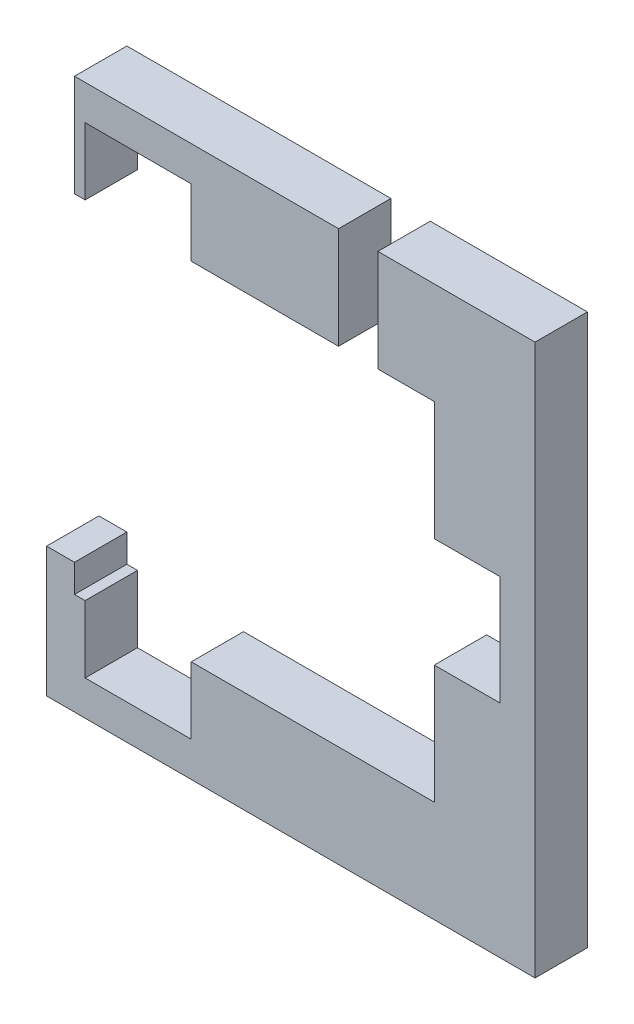
ISO-10303-21;
HEADER;
FILE_DESCRIPTION(('STEP AP214'),'2;1');
FILE_NAME('part.step','',(''),(''),'','','');
FILE_SCHEMA(('AUTOMOTIVE_DESIGN { 1 0 10303 214 1 1 1 1 }'));
ENDSEC;
DATA;
#1=APPLICATION_CONTEXT('core data for automotive mechanical design processes');
#2=APPLICATION_PROTOCOL_DEFINITION('international standard','automotive_design',2000,#1);
#3=PRODUCT_CONTEXT('',#1,'mechanical');
#4=PRODUCT('Part','Part','',(#3));
#5=PRODUCT_RELATED_PRODUCT_CATEGORY('part','',(#4));
#6=PRODUCT_DEFINITION_FORMATION('','',#4);
#7=PRODUCT_DEFINITION_CONTEXT('part definition',#1,'design');
#8=PRODUCT_DEFINITION('design','',#6,#7);
#9=PRODUCT_DEFINITION_SHAPE('','',#8);
#10=(LENGTH_UNIT() NAMED_UNIT(*) SI_UNIT(.MILLI.,.METRE.));
#11=(NAMED_UNIT(*) PLANE_ANGLE_UNIT() SI_UNIT($,.RADIAN.));
#12=(NAMED_UNIT(*) SI_UNIT($,.STERADIAN.) SOLID_ANGLE_UNIT());
#13=UNCERTAINTY_MEASURE_WITH_UNIT(LENGTH_MEASURE(1.E-05),#10,'distance_accuracy_value','');
#14=(GEOMETRIC_REPRESENTATION_CONTEXT(3) GLOBAL_UNCERTAINTY_ASSIGNED_CONTEXT((#13)) GLOBAL_UNIT_ASSIGNED_CONTEXT((#10,
#11,#12)) REPRESENTATION_CONTEXT('',''));
#15=CARTESIAN_POINT('',(0.,0.,0.));
#16=DIRECTION('',(0.,0.,1.));
#17=DIRECTION('',(1.,0.,0.));
#18=AXIS2_PLACEMENT_3D('',#15,#16,#17);
#19=CARTESIAN_POINT('',(7544.80021660651,3379.61343651415,-4.7625));
#20=DIRECTION('',(0.,1.,0.));
#21=DIRECTION('',(0.,0.,-1.));
#22=AXIS2_PLACEMENT_3D('',#19,#20,#21);
#23=PLANE('',#22);
#24=DIRECTION('',(1.,0.,0.));
#25=VECTOR('',#24,1.);
#26=CARTESIAN_POINT('',(7544.80021660651,3379.61343651415,0.));
#27=LINE('',#26,#25);
#28=CARTESIAN_POINT('',(7544.80021660651,3379.61343651415,0.));
#29=VERTEX_POINT('',#28);
#30=CARTESIAN_POINT('',(7589.25021660651,3379.61343651415,0.));
#31=VERTEX_POINT('',#30);
#32=EDGE_CURVE('E200',#29,#31,#27,.T.);
#33=ORIENTED_EDGE('',*,*,#32,.F.);
#34=DIRECTION('',(0.,0.,1.));
#35=VECTOR('',#34,1.);
#36=CARTESIAN_POINT('',(7544.80021660651,3379.61343651415,-4.7625));
#37=LINE('',#36,#35);
#38=CARTESIAN_POINT('',(7544.80021660651,3379.61343651415,-4.7625));
#39=VERTEX_POINT('',#38);
#40=EDGE_CURVE('E199',#39,#29,#37,.T.);
#41=ORIENTED_EDGE('',*,*,#40,.F.);
#42=DIRECTION('',(1.,0.,0.));
#43=VECTOR('',#42,1.);
#44=CARTESIAN_POINT('',(7544.80021660651,3379.61343651415,-4.7625));
#45=LINE('',#44,#43);
#46=CARTESIAN_POINT('',(7589.25021660651,3379.61343651415,-4.7625));
#47=VERTEX_POINT('',#46);
#48=EDGE_CURVE('E248',#39,#47,#45,.T.);
#49=ORIENTED_EDGE('',*,*,#48,.T.);
#50=DIRECTION('',(0.,0.,1.));
#51=VECTOR('',#50,1.);
#52=CARTESIAN_POINT('',(7589.25021660651,3379.61343651415,-4.7625));
#53=LINE('',#52,#51);
#54=EDGE_CURVE('E12',#47,#31,#53,.T.);
#55=ORIENTED_EDGE('',*,*,#54,.T.);
#56=EDGE_LOOP('',(#33,#41,#49,#55));
#57=FACE_BOUND('',#56,.T.);
#58=ADVANCED_FACE('F44',(#57),#23,.F.);
#59=CARTESIAN_POINT('',(7589.25021660651,3429.72763651415,-4.7625));
#60=DIRECTION('',(-1.,0.,0.));
#61=DIRECTION('',(0.,0.,-1.));
#62=AXIS2_PLACEMENT_3D('',#59,#60,#61);
#63=PLANE('',#62);
#64=DIRECTION('',(0.,1.,0.));
#65=VECTOR('',#64,1.);
#66=CARTESIAN_POINT('',(7589.25021660651,3429.72763651415,0.));
#67=LINE('',#66,#65);
#68=CARTESIAN_POINT('',(7589.25021660651,3429.72763651415,0.));
#69=VERTEX_POINT('',#68);
#70=EDGE_CURVE('E202',#31,#69,#67,.T.);
#71=ORIENTED_EDGE('',*,*,#70,.F.);
#72=ORIENTED_EDGE('',*,*,#54,.F.);
#73=DIRECTION('',(0.,1.,0.));
#74=VECTOR('',#73,1.);
#75=CARTESIAN_POINT('',(7589.25021660651,3429.72763651415,-4.7625));
#76=LINE('',#75,#74);
#77=CARTESIAN_POINT('',(7589.25021660651,3429.72763651415,-4.7625));
#78=VERTEX_POINT('',#77);
#79=EDGE_CURVE('E128',#47,#78,#76,.T.);
#80=ORIENTED_EDGE('',*,*,#79,.T.);
#81=DIRECTION('',(0.,0.,1.));
#82=VECTOR('',#81,1.);
#83=CARTESIAN_POINT('',(7589.25021660651,3429.72763651415,-4.7625));
#84=LINE('',#83,#82);
#85=EDGE_CURVE('E52',#78,#69,#84,.T.);
#86=ORIENTED_EDGE('',*,*,#85,.T.);
#87=EDGE_LOOP('',(#71,#72,#80,#86));
#88=FACE_BOUND('',#87,.T.);
#89=ADVANCED_FACE('F290',(#88),#63,.F.);
#90=CARTESIAN_POINT('',(7574.95001660651,3429.72763651415,-4.7625));
#91=DIRECTION('',(0.,-1.,0.));
#92=DIRECTION('',(1.,0.,0.));
#93=AXIS2_PLACEMENT_3D('',#90,#91,#92);
#94=PLANE('',#93);
#95=DIRECTION('',(-1.,0.,0.));
#96=VECTOR('',#95,1.);
#97=CARTESIAN_POINT('',(7574.95001660651,3429.72763651415,0.));
#98=LINE('',#97,#96);
#99=CARTESIAN_POINT('',(7574.95001660651,3429.72763651415,0.));
#100=VERTEX_POINT('',#99);
#101=EDGE_CURVE('E205',#69,#100,#98,.T.);
#102=ORIENTED_EDGE('',*,*,#101,.F.);
#103=ORIENTED_EDGE('',*,*,#85,.F.);
#104=DIRECTION('',(-1.,0.,0.));
#105=VECTOR('',#104,1.);
#106=CARTESIAN_POINT('',(7574.95001660651,3429.72763651415,-4.7625));
#107=LINE('',#106,#105);
#108=CARTESIAN_POINT('',(7574.95001660651,3429.72763651415,-4.7625));
#109=VERTEX_POINT('',#108);
#110=EDGE_CURVE('E299',#78,#109,#107,.T.);
#111=ORIENTED_EDGE('',*,*,#110,.T.);
#112=DIRECTION('',(0.,0.,1.));
#113=VECTOR('',#112,1.);
#114=CARTESIAN_POINT('',(7574.95001660651,3429.72763651415,-4.7625));
#115=LINE('',#114,#113);
#116=EDGE_CURVE('E285',#109,#100,#115,.T.);
#117=ORIENTED_EDGE('',*,*,#116,.T.);
#118=EDGE_LOOP('',(#102,#103,#111,#117));
#119=FACE_BOUND('',#118,.T.);
#120=ADVANCED_FACE('F369',(#119),#94,.F.);
#121=CARTESIAN_POINT('',(7574.95001660651,3429.72763651415,-4.7625));
#122=DIRECTION('',(1.,-1.91603585309036E-13,0.));
#123=DIRECTION('',(1.91603585309036E-13,1.,0.));
#124=AXIS2_PLACEMENT_3D('',#121,#122,#123);
#125=PLANE('',#124);
#126=DIRECTION('',(-1.91603585309036E-13,-1.,0.));
#127=VECTOR('',#126,1.);
#128=CARTESIAN_POINT('',(7574.95001660651,3429.72763651415,0.));
#129=LINE('',#128,#127);
#130=CARTESIAN_POINT('',(7574.95001660651,3420.45663651415,0.));
#131=VERTEX_POINT('',#130);
#132=EDGE_CURVE('E208',#100,#131,#129,.T.);
#133=ORIENTED_EDGE('',*,*,#132,.F.);
#134=ORIENTED_EDGE('',*,*,#116,.F.);
#135=DIRECTION('',(-1.91603585309036E-13,-1.,0.));
#136=VECTOR('',#135,1.);
#137=CARTESIAN_POINT('',(7574.95001660651,3429.72763651415,-4.7625));
#138=LINE('',#137,#136);
#139=CARTESIAN_POINT('',(7574.95001660651,3420.45663651415,-4.7625));
#140=VERTEX_POINT('',#139);
#141=EDGE_CURVE('E303',#109,#140,#138,.T.);
#142=ORIENTED_EDGE('',*,*,#141,.T.);
#143=DIRECTION('',(0.,0.,1.));
#144=VECTOR('',#143,1.);
#145=CARTESIAN_POINT('',(7574.95001660651,3420.45663651415,-4.7625));
#146=LINE('',#145,#144);
#147=EDGE_CURVE('E282',#140,#131,#146,.T.);
#148=ORIENTED_EDGE('',*,*,#147,.T.);
#149=EDGE_LOOP('',(#133,#134,#142,#148));
#150=FACE_BOUND('',#149,.T.);
#151=ADVANCED_FACE('F368',(#150),#125,.F.);
#152=CARTESIAN_POINT('',(7574.95001660651,3420.45663651415,-4.7625));
#153=DIRECTION('',(0.,1.,0.));
#154=DIRECTION('',(0.,0.,-1.));
#155=AXIS2_PLACEMENT_3D('',#152,#153,#154);
#156=PLANE('',#155);
#157=DIRECTION('',(1.,0.,0.));
#158=VECTOR('',#157,1.);
#159=CARTESIAN_POINT('',(7574.95001660651,3420.45663651415,0.));
#160=LINE('',#159,#158);
#161=CARTESIAN_POINT('',(7580.08081660651,3420.45663651415,0.));
#162=VERTEX_POINT('',#161);
#163=EDGE_CURVE('E211',#131,#162,#160,.T.);
#164=ORIENTED_EDGE('',*,*,#163,.F.);
#165=ORIENTED_EDGE('',*,*,#147,.F.);
#166=DIRECTION('',(1.,0.,0.));
#167=VECTOR('',#166,1.);
#168=CARTESIAN_POINT('',(7574.95001660651,3420.45663651415,-4.7625));
#169=LINE('',#168,#167);
#170=CARTESIAN_POINT('',(7580.08081660651,3420.45663651415,-4.7625));
#171=VERTEX_POINT('',#170);
#172=EDGE_CURVE('E306',#140,#171,#169,.T.);
#173=ORIENTED_EDGE('',*,*,#172,.T.);
#174=DIRECTION('',(0.,0.,1.));
#175=VECTOR('',#174,1.);
#176=CARTESIAN_POINT('',(7580.08081660651,3420.45663651415,-4.7625));
#177=LINE('',#176,#175);
#178=EDGE_CURVE('E279',#171,#162,#177,.T.);
#179=ORIENTED_EDGE('',*,*,#178,.T.);
#180=EDGE_LOOP('',(#164,#165,#173,#179));
#181=FACE_BOUND('',#180,.T.);
#182=ADVANCED_FACE('F366',(#181),#156,.F.);
#183=CARTESIAN_POINT('',(7580.08081660651,3420.45663651415,-4.7625));
#184=DIRECTION('',(1.,0.,0.));
#185=DIRECTION('',(0.,0.,1.));
#186=AXIS2_PLACEMENT_3D('',#183,#184,#185);
#187=PLANE('',#186);
#188=DIRECTION('',(0.,-1.,0.));
#189=VECTOR('',#188,1.);
#190=CARTESIAN_POINT('',(7580.08081660651,3420.45663651415,0.));
#191=LINE('',#190,#189);
#192=CARTESIAN_POINT('',(7580.08081660651,3409.64893651415,0.));
#193=VERTEX_POINT('',#192);
#194=EDGE_CURVE('E214',#162,#193,#191,.T.);
#195=ORIENTED_EDGE('',*,*,#194,.F.);
#196=ORIENTED_EDGE('',*,*,#178,.F.);
#197=DIRECTION('',(0.,-1.,0.));
#198=VECTOR('',#197,1.);
#199=CARTESIAN_POINT('',(7580.08081660651,3420.45663651415,-4.7625));
#200=LINE('',#199,#198);
#201=CARTESIAN_POINT('',(7580.08081660651,3409.64893651415,-4.7625));
#202=VERTEX_POINT('',#201);
#203=EDGE_CURVE('E309',#171,#202,#200,.T.);
#204=ORIENTED_EDGE('',*,*,#203,.T.);
#205=DIRECTION('',(0.,0.,1.));
#206=VECTOR('',#205,1.);
#207=CARTESIAN_POINT('',(7580.08081660651,3409.64893651415,-4.7625));
#208=LINE('',#207,#206);
#209=EDGE_CURVE('E276',#202,#193,#208,.T.);
#210=ORIENTED_EDGE('',*,*,#209,.T.);
#211=EDGE_LOOP('',(#195,#196,#204,#210));
#212=FACE_BOUND('',#211,.T.);
#213=ADVANCED_FACE('F362',(#212),#187,.F.);
#214=CARTESIAN_POINT('',(7580.08081660651,3409.64893651415,-4.7625));
#215=DIRECTION('',(0.,1.,0.));
#216=DIRECTION('',(0.,0.,-1.));
#217=AXIS2_PLACEMENT_3D('',#214,#215,#216);
#218=PLANE('',#217);
#219=DIRECTION('',(1.,0.,0.));
#220=VECTOR('',#219,1.);
#221=CARTESIAN_POINT('',(7580.08081660651,3409.64893651415,0.));
#222=LINE('',#221,#220);
#223=CARTESIAN_POINT('',(7586.07521660651,3409.64893651415,0.));
#224=VERTEX_POINT('',#223);
#225=EDGE_CURVE('E217',#193,#224,#222,.T.);
#226=ORIENTED_EDGE('',*,*,#225,.F.);
#227=ORIENTED_EDGE('',*,*,#209,.F.);
#228=DIRECTION('',(1.,0.,0.));
#229=VECTOR('',#228,1.);
#230=CARTESIAN_POINT('',(7580.08081660651,3409.64893651415,-4.7625));
#231=LINE('',#230,#229);
#232=CARTESIAN_POINT('',(7586.07521660651,3409.64893651415,-4.7625));
#233=VERTEX_POINT('',#232);
#234=EDGE_CURVE('E312',#202,#233,#231,.T.);
#235=ORIENTED_EDGE('',*,*,#234,.T.);
#236=DIRECTION('',(0.,0.,1.));
#237=VECTOR('',#236,1.);
#238=CARTESIAN_POINT('',(7586.07521660651,3409.64893651415,-4.7625));
#239=LINE('',#238,#237);
#240=EDGE_CURVE('E273',#233,#224,#239,.T.);
#241=ORIENTED_EDGE('',*,*,#240,.T.);
#242=EDGE_LOOP('',(#226,#227,#235,#241));
#243=FACE_BOUND('',#242,.T.);
#244=ADVANCED_FACE('F359',(#243),#218,.F.);
#245=CARTESIAN_POINT('',(7586.07521660651,3409.64893651415,-4.7625));
#246=DIRECTION('',(1.,0.,0.));
#247=DIRECTION('',(0.,0.,1.));
#248=AXIS2_PLACEMENT_3D('',#245,#246,#247);
#249=PLANE('',#248);
#250=DIRECTION('',(0.,-1.,0.));
#251=VECTOR('',#250,1.);
#252=CARTESIAN_POINT('',(7586.07521660651,3409.64893651415,0.));
#253=LINE('',#252,#251);
#254=CARTESIAN_POINT('',(7586.07521660651,3399.69213651415,0.));
#255=VERTEX_POINT('',#254);
#256=EDGE_CURVE('E220',#224,#255,#253,.T.);
#257=ORIENTED_EDGE('',*,*,#256,.F.);
#258=ORIENTED_EDGE('',*,*,#240,.F.);
#259=DIRECTION('',(0.,-1.,0.));
#260=VECTOR('',#259,1.);
#261=CARTESIAN_POINT('',(7586.07521660651,3409.64893651415,-4.7625));
#262=LINE('',#261,#260);
#263=CARTESIAN_POINT('',(7586.07521660651,3399.69213651415,-4.7625));
#264=VERTEX_POINT('',#263);
#265=EDGE_CURVE('E315',#233,#264,#262,.T.);
#266=ORIENTED_EDGE('',*,*,#265,.T.);
#267=DIRECTION('',(0.,0.,1.));
#268=VECTOR('',#267,1.);
#269=CARTESIAN_POINT('',(7586.07521660651,3399.69213651415,-4.7625));
#270=LINE('',#269,#268);
#271=EDGE_CURVE('E270',#264,#255,#270,.T.);
#272=ORIENTED_EDGE('',*,*,#271,.T.);
#273=EDGE_LOOP('',(#257,#258,#266,#272));
#274=FACE_BOUND('',#273,.T.);
#275=ADVANCED_FACE('F357',(#274),#249,.F.);
#276=CARTESIAN_POINT('',(7580.08081660651,3399.69213651415,-4.7625));
#277=DIRECTION('',(0.,-1.,0.));
#278=DIRECTION('',(0.,0.,1.));
#279=AXIS2_PLACEMENT_3D('',#276,#277,#278);
#280=PLANE('',#279);
#281=DIRECTION('',(-1.,0.,0.));
#282=VECTOR('',#281,1.);
#283=CARTESIAN_POINT('',(7580.08081660651,3399.69213651415,0.));
#284=LINE('',#283,#282);
#285=CARTESIAN_POINT('',(7580.08081660651,3399.69213651415,0.));
#286=VERTEX_POINT('',#285);
#287=EDGE_CURVE('E223',#255,#286,#284,.T.);
#288=ORIENTED_EDGE('',*,*,#287,.F.);
#289=ORIENTED_EDGE('',*,*,#271,.F.);
#290=DIRECTION('',(-1.,0.,0.));
#291=VECTOR('',#290,1.);
#292=CARTESIAN_POINT('',(7580.08081660651,3399.69213651415,-4.7625));
#293=LINE('',#292,#291);
#294=CARTESIAN_POINT('',(7580.08081660651,3399.69213651415,-4.7625));
#295=VERTEX_POINT('',#294);
#296=EDGE_CURVE('E318',#264,#295,#293,.T.);
#297=ORIENTED_EDGE('',*,*,#296,.T.);
#298=DIRECTION('',(0.,0.,1.));
#299=VECTOR('',#298,1.);
#300=CARTESIAN_POINT('',(7580.08081660651,3399.69213651415,-4.7625));
#301=LINE('',#300,#299);
#302=EDGE_CURVE('E267',#295,#286,#301,.T.);
#303=ORIENTED_EDGE('',*,*,#302,.T.);
#304=EDGE_LOOP('',(#288,#289,#297,#303));
#305=FACE_BOUND('',#304,.T.);
#306=ADVANCED_FACE('F353',(#305),#280,.F.);
#307=CARTESIAN_POINT('',(7580.08081660651,3399.69213651415,-4.7625));
#308=DIRECTION('',(1.,0.,0.));
#309=DIRECTION('',(0.,0.,1.));
#310=AXIS2_PLACEMENT_3D('',#307,#308,#309);
#311=PLANE('',#310);
#312=DIRECTION('',(0.,-1.,0.));
#313=VECTOR('',#312,1.);
#314=CARTESIAN_POINT('',(7580.08081660651,3399.69213651415,0.));
#315=LINE('',#314,#313);
#316=CARTESIAN_POINT('',(7580.08081660651,3388.88443651415,0.));
#317=VERTEX_POINT('',#316);
#318=EDGE_CURVE('E226',#286,#317,#315,.T.);
#319=ORIENTED_EDGE('',*,*,#318,.F.);
#320=ORIENTED_EDGE('',*,*,#302,.F.);
#321=DIRECTION('',(0.,-1.,0.));
#322=VECTOR('',#321,1.);
#323=CARTESIAN_POINT('',(7580.08081660651,3399.69213651415,-4.7625));
#324=LINE('',#323,#322);
#325=CARTESIAN_POINT('',(7580.08081660651,3388.88443651415,-4.7625));
#326=VERTEX_POINT('',#325);
#327=EDGE_CURVE('E321',#295,#326,#324,.T.);
#328=ORIENTED_EDGE('',*,*,#327,.T.);
#329=DIRECTION('',(0.,0.,1.));
#330=VECTOR('',#329,1.);
#331=CARTESIAN_POINT('',(7580.08081660651,3388.88443651415,-4.7625));
#332=LINE('',#331,#330);
#333=EDGE_CURVE('E264',#326,#317,#332,.T.);
#334=ORIENTED_EDGE('',*,*,#333,.T.);
#335=EDGE_LOOP('',(#319,#320,#328,#334));
#336=FACE_BOUND('',#335,.T.);
#337=ADVANCED_FACE('F350',(#336),#311,.F.);
#338=CARTESIAN_POINT('',(7580.08081660651,3388.88443651415,-4.7625));
#339=DIRECTION('',(0.,-1.,0.));
#340=DIRECTION('',(0.,0.,1.));
#341=AXIS2_PLACEMENT_3D('',#338,#339,#340);
#342=PLANE('',#341);
#343=DIRECTION('',(-1.,0.,0.));
#344=VECTOR('',#343,1.);
#345=CARTESIAN_POINT('',(7580.08081660651,3388.88443651415,0.));
#346=LINE('',#345,#344);
#347=CARTESIAN_POINT('',(7557.95741660651,3388.88443651415,0.));
#348=VERTEX_POINT('',#347);
#349=EDGE_CURVE('E229',#317,#348,#346,.T.);
#350=ORIENTED_EDGE('',*,*,#349,.F.);
#351=ORIENTED_EDGE('',*,*,#333,.F.);
#352=DIRECTION('',(-1.,0.,0.));
#353=VECTOR('',#352,1.);
#354=CARTESIAN_POINT('',(7580.08081660651,3388.88443651415,-4.7625));
#355=LINE('',#354,#353);
#356=CARTESIAN_POINT('',(7557.95741660651,3388.88443651415,-4.7625));
#357=VERTEX_POINT('',#356);
#358=EDGE_CURVE('E324',#326,#357,#355,.T.);
#359=ORIENTED_EDGE('',*,*,#358,.T.);
#360=DIRECTION('',(0.,0.,1.));
#361=VECTOR('',#360,1.);
#362=CARTESIAN_POINT('',(7557.95741660651,3388.88443651415,-4.7625));
#363=LINE('',#362,#361);
#364=EDGE_CURVE('E261',#357,#348,#363,.T.);
#365=ORIENTED_EDGE('',*,*,#364,.T.);
#366=EDGE_LOOP('',(#350,#351,#359,#365));
#367=FACE_BOUND('',#366,.T.);
#368=ADVANCED_FACE('F348',(#367),#342,.F.);
#369=CARTESIAN_POINT('',(7557.95741660651,3388.88443651415,-4.7625));
#370=DIRECTION('',(1.,2.91397119324194E-13,0.));
#371=DIRECTION('',(-2.91397119324194E-13,1.,0.));
#372=AXIS2_PLACEMENT_3D('',#369,#370,#371);
#373=PLANE('',#372);
#374=DIRECTION('',(2.91397119324194E-13,-1.,0.));
#375=VECTOR('',#374,1.);
#376=CARTESIAN_POINT('',(7557.95741660651,3388.88443651415,0.));
#377=LINE('',#376,#375);
#378=CARTESIAN_POINT('',(7557.95741660651,3382.78843651415,0.));
#379=VERTEX_POINT('',#378);
#380=EDGE_CURVE('E232',#348,#379,#377,.T.);
#381=ORIENTED_EDGE('',*,*,#380,.F.);
#382=ORIENTED_EDGE('',*,*,#364,.F.);
#383=DIRECTION('',(2.91397119324194E-13,-1.,0.));
#384=VECTOR('',#383,1.);
#385=CARTESIAN_POINT('',(7557.95741660651,3388.88443651415,-4.7625));
#386=LINE('',#385,#384);
#387=CARTESIAN_POINT('',(7557.95741660651,3382.78843651415,-4.7625));
#388=VERTEX_POINT('',#387);
#389=EDGE_CURVE('E327',#357,#388,#386,.T.);
#390=ORIENTED_EDGE('',*,*,#389,.T.);
#391=DIRECTION('',(0.,0.,1.));
#392=VECTOR('',#391,1.);
#393=CARTESIAN_POINT('',(7557.95741660651,3382.78843651415,-4.7625));
#394=LINE('',#393,#392);
#395=EDGE_CURVE('E258',#388,#379,#394,.T.);
#396=ORIENTED_EDGE('',*,*,#395,.T.);
#397=EDGE_LOOP('',(#381,#382,#390,#396));
#398=FACE_BOUND('',#397,.T.);
#399=ADVANCED_FACE('F344',(#398),#373,.F.);
#400=CARTESIAN_POINT('',(7548.30541660651,3382.78843651415,-4.7625));
#401=DIRECTION('',(0.,-1.,0.));
#402=DIRECTION('',(0.,0.,1.));
#403=AXIS2_PLACEMENT_3D('',#400,#401,#402);
#404=PLANE('',#403);
#405=DIRECTION('',(-1.,0.,0.));
#406=VECTOR('',#405,1.);
#407=CARTESIAN_POINT('',(7548.30541660651,3382.78843651415,0.));
#408=LINE('',#407,#406);
#409=CARTESIAN_POINT('',(7548.30541660651,3382.78843651415,0.));
#410=VERTEX_POINT('',#409);
#411=EDGE_CURVE('E235',#379,#410,#408,.T.);
#412=ORIENTED_EDGE('',*,*,#411,.F.);
#413=ORIENTED_EDGE('',*,*,#395,.F.);
#414=DIRECTION('',(-1.,0.,0.));
#415=VECTOR('',#414,1.);
#416=CARTESIAN_POINT('',(7548.30541660651,3382.78843651415,-4.7625));
#417=LINE('',#416,#415);
#418=CARTESIAN_POINT('',(7548.30541660651,3382.78843651415,-4.7625));
#419=VERTEX_POINT('',#418);
#420=EDGE_CURVE('E330',#388,#419,#417,.T.);
#421=ORIENTED_EDGE('',*,*,#420,.T.);
#422=DIRECTION('',(0.,0.,1.));
#423=VECTOR('',#422,1.);
#424=CARTESIAN_POINT('',(7548.30541660651,3382.78843651415,-4.7625));
#425=LINE('',#424,#423);
#426=EDGE_CURVE('E255',#419,#410,#425,.T.);
#427=ORIENTED_EDGE('',*,*,#426,.T.);
#428=EDGE_LOOP('',(#412,#413,#421,#427));
#429=FACE_BOUND('',#428,.T.);
#430=ADVANCED_FACE('F341',(#429),#404,.F.);
#431=CARTESIAN_POINT('',(7548.30541660651,3388.88443651415,-4.7625));
#432=DIRECTION('',(-1.,0.,0.));
#433=DIRECTION('',(0.,0.,-1.));
#434=AXIS2_PLACEMENT_3D('',#431,#432,#433);
#435=PLANE('',#434);
#436=DIRECTION('',(0.,1.,0.));
#437=VECTOR('',#436,1.);
#438=CARTESIAN_POINT('',(7548.30541660651,3388.88443651415,0.));
#439=LINE('',#438,#437);
#440=CARTESIAN_POINT('',(7548.30541660651,3388.88443651415,0.));
#441=VERTEX_POINT('',#440);
#442=EDGE_CURVE('E238',#410,#441,#439,.T.);
#443=ORIENTED_EDGE('',*,*,#442,.F.);
#444=ORIENTED_EDGE('',*,*,#426,.F.);
#445=DIRECTION('',(0.,1.,0.));
#446=VECTOR('',#445,1.);
#447=CARTESIAN_POINT('',(7548.30541660651,3388.88443651415,-4.7625));
#448=LINE('',#447,#446);
#449=CARTESIAN_POINT('',(7548.30541660651,3388.88443651415,-4.7625));
#450=VERTEX_POINT('',#449);
#451=EDGE_CURVE('E194',#419,#450,#448,.T.);
#452=ORIENTED_EDGE('',*,*,#451,.T.);
#453=DIRECTION('',(0.,0.,1.));
#454=VECTOR('',#453,1.);
#455=CARTESIAN_POINT('',(7548.30541660651,3388.88443651415,-4.7625));
#456=LINE('',#455,#454);
#457=EDGE_CURVE('E252',#450,#441,#456,.T.);
#458=ORIENTED_EDGE('',*,*,#457,.T.);
#459=EDGE_LOOP('',(#443,#444,#452,#458));
#460=FACE_BOUND('',#459,.T.);
#461=ADVANCED_FACE('F335',(#460),#435,.F.);
#462=CARTESIAN_POINT('',(7548.30541660651,3388.88443651415,-4.7625));
#463=DIRECTION('',(0.,-1.,0.));
#464=DIRECTION('',(0.,0.,1.));
#465=AXIS2_PLACEMENT_3D('',#462,#463,#464);
#466=PLANE('',#465);
#467=DIRECTION('',(-1.,0.,0.));
#468=VECTOR('',#467,1.);
#469=CARTESIAN_POINT('',(7548.30541660651,3388.88443651415,0.));
#470=LINE('',#469,#468);
#471=CARTESIAN_POINT('',(7547.34021660651,3388.88443651415,0.));
#472=VERTEX_POINT('',#471);
#473=EDGE_CURVE('E241',#441,#472,#470,.T.);
#474=ORIENTED_EDGE('',*,*,#473,.F.);
#475=ORIENTED_EDGE('',*,*,#457,.F.);
#476=DIRECTION('',(-1.,0.,0.));
#477=VECTOR('',#476,1.);
#478=CARTESIAN_POINT('',(7548.30541660651,3388.88443651415,-4.7625));
#479=LINE('',#478,#477);
#480=CARTESIAN_POINT('',(7547.34021660651,3388.88443651415,-4.7625));
#481=VERTEX_POINT('',#480);
#482=EDGE_CURVE('E192',#450,#481,#479,.T.);
#483=ORIENTED_EDGE('',*,*,#482,.T.);
#484=DIRECTION('',(0.,0.,1.));
#485=VECTOR('',#484,1.);
#486=CARTESIAN_POINT('',(7547.34021660651,3388.88443651415,-4.7625));
#487=LINE('',#486,#485);
#488=EDGE_CURVE('E186',#481,#472,#487,.T.);
#489=ORIENTED_EDGE('',*,*,#488,.T.);
#490=EDGE_LOOP('',(#474,#475,#483,#489));
#491=FACE_BOUND('',#490,.T.);
#492=ADVANCED_FACE('F339',(#491),#466,.F.);
#493=CARTESIAN_POINT('',(7547.34021660651,3391.42443651415,-4.7625));
#494=DIRECTION('',(-1.,0.,0.));
#495=DIRECTION('',(0.,0.,-1.));
#496=AXIS2_PLACEMENT_3D('',#493,#494,#495);
#497=PLANE('',#496);
#498=DIRECTION('',(0.,1.,0.));
#499=VECTOR('',#498,1.);
#500=CARTESIAN_POINT('',(7547.34021660651,3391.42443651415,0.));
#501=LINE('',#500,#499);
#502=CARTESIAN_POINT('',(7547.34021660651,3391.42443651415,0.));
#503=VERTEX_POINT('',#502);
#504=EDGE_CURVE('E244',#472,#503,#501,.T.);
#505=ORIENTED_EDGE('',*,*,#504,.F.);
#506=ORIENTED_EDGE('',*,*,#488,.F.);
#507=DIRECTION('',(0.,1.,0.));
#508=VECTOR('',#507,1.);
#509=CARTESIAN_POINT('',(7547.34021660651,3391.42443651415,-4.7625));
#510=LINE('',#509,#508);
#511=CARTESIAN_POINT('',(7547.34021660651,3391.42443651415,-4.7625));
#512=VERTEX_POINT('',#511);
#513=EDGE_CURVE('E176',#481,#512,#510,.T.);
#514=ORIENTED_EDGE('',*,*,#513,.T.);
#515=DIRECTION('',(0.,0.,1.));
#516=VECTOR('',#515,1.);
#517=CARTESIAN_POINT('',(7547.34021660651,3391.42443651415,-4.7625));
#518=LINE('',#517,#516);
#519=EDGE_CURVE('E181',#512,#503,#518,.T.);
#520=ORIENTED_EDGE('',*,*,#519,.T.);
#521=EDGE_LOOP('',(#505,#506,#514,#520));
#522=FACE_BOUND('',#521,.T.);
#523=ADVANCED_FACE('F189',(#522),#497,.F.);
#524=CARTESIAN_POINT('',(7547.34021660651,3391.42443651415,-4.7625));
#525=DIRECTION('',(0.,-1.,0.));
#526=DIRECTION('',(0.,0.,1.));
#527=AXIS2_PLACEMENT_3D('',#524,#525,#526);
#528=PLANE('',#527);
#529=DIRECTION('',(-1.,0.,0.));
#530=VECTOR('',#529,1.);
#531=CARTESIAN_POINT('',(7547.34021660651,3391.42443651415,0.));
#532=LINE('',#531,#530);
#533=CARTESIAN_POINT('',(7544.80021660651,3391.42443651415,0.));
#534=VERTEX_POINT('',#533);
#535=EDGE_CURVE('E183',#503,#534,#532,.T.);
#536=ORIENTED_EDGE('',*,*,#535,.F.);
#537=ORIENTED_EDGE('',*,*,#519,.F.);
#538=DIRECTION('',(-1.,0.,0.));
#539=VECTOR('',#538,1.);
#540=CARTESIAN_POINT('',(7547.34021660651,3391.42443651415,-4.7625));
#541=LINE('',#540,#539);
#542=CARTESIAN_POINT('',(7544.80021660651,3391.42443651415,-4.7625));
#543=VERTEX_POINT('',#542);
#544=EDGE_CURVE('E172',#512,#543,#541,.T.);
#545=ORIENTED_EDGE('',*,*,#544,.T.);
#546=DIRECTION('',(0.,0.,1.));
#547=VECTOR('',#546,1.);
#548=CARTESIAN_POINT('',(7544.80021660651,3391.42443651415,-4.7625));
#549=LINE('',#548,#547);
#550=EDGE_CURVE('E187',#543,#534,#549,.T.);
#551=ORIENTED_EDGE('',*,*,#550,.T.);
#552=EDGE_LOOP('',(#536,#537,#545,#551));
#553=FACE_BOUND('',#552,.T.);
#554=ADVANCED_FACE('F182',(#553),#528,.F.);
#555=CARTESIAN_POINT('',(7544.80021660651,3379.61343651415,-4.7625));
#556=DIRECTION('',(1.,0.,0.));
#557=DIRECTION('',(0.,0.,1.));
#558=AXIS2_PLACEMENT_3D('',#555,#556,#557);
#559=PLANE('',#558);
#560=DIRECTION('',(0.,-1.,0.));
#561=VECTOR('',#560,1.);
#562=CARTESIAN_POINT('',(7544.80021660651,3379.61343651415,0.));
#563=LINE('',#562,#561);
#564=EDGE_CURVE('E116',#534,#29,#563,.T.);
#565=ORIENTED_EDGE('',*,*,#564,.F.);
#566=ORIENTED_EDGE('',*,*,#550,.F.);
#567=DIRECTION('',(0.,-1.,0.));
#568=VECTOR('',#567,1.);
#569=CARTESIAN_POINT('',(7544.80021660651,3379.61343651415,-4.7625));
#570=LINE('',#569,#568);
#571=EDGE_CURVE('E60',#543,#39,#570,.T.);
#572=ORIENTED_EDGE('',*,*,#571,.T.);
#573=ORIENTED_EDGE('',*,*,#40,.T.);
#574=EDGE_LOOP('',(#565,#566,#572,#573));
#575=FACE_BOUND('',#574,.T.);
#576=ADVANCED_FACE('F499',(#575),#559,.F.);
#577=CARTESIAN_POINT('',(0.,0.,-4.7625));
#578=DIRECTION('',(0.,0.,1.));
#579=DIRECTION('',(-1.,0.,0.));
#580=AXIS2_PLACEMENT_3D('',#577,#578,#579);
#581=PLANE('',#580);
#582=ORIENTED_EDGE('',*,*,#48,.F.);
#583=ORIENTED_EDGE('',*,*,#571,.F.);
#584=ORIENTED_EDGE('',*,*,#544,.F.);
#585=ORIENTED_EDGE('',*,*,#513,.F.);
#586=ORIENTED_EDGE('',*,*,#482,.F.);
#587=ORIENTED_EDGE('',*,*,#451,.F.);
#588=ORIENTED_EDGE('',*,*,#420,.F.);
#589=ORIENTED_EDGE('',*,*,#389,.F.);
#590=ORIENTED_EDGE('',*,*,#358,.F.);
#591=ORIENTED_EDGE('',*,*,#327,.F.);
#592=ORIENTED_EDGE('',*,*,#296,.F.);
#593=ORIENTED_EDGE('',*,*,#265,.F.);
#594=ORIENTED_EDGE('',*,*,#234,.F.);
#595=ORIENTED_EDGE('',*,*,#203,.F.);
#596=ORIENTED_EDGE('',*,*,#172,.F.);
#597=ORIENTED_EDGE('',*,*,#141,.F.);
#598=ORIENTED_EDGE('',*,*,#110,.F.);
#599=ORIENTED_EDGE('',*,*,#79,.F.);
#600=EDGE_LOOP('',(#582,#583,#584,#585,#586,#587,#588,#589,#590,#591,#592,#593,#594,#595,#596,
#597,#598,#599));
#601=FACE_BOUND('',#600,.T.);
#602=ADVANCED_FACE('F174',(#601),#581,.F.);
#603=CARTESIAN_POINT('',(0.,0.,0.));
#604=DIRECTION('',(0.,0.,1.));
#605=DIRECTION('',(-1.,0.,0.));
#606=AXIS2_PLACEMENT_3D('',#603,#604,#605);
#607=PLANE('',#606);
#608=ORIENTED_EDGE('',*,*,#32,.T.);
#609=ORIENTED_EDGE('',*,*,#70,.T.);
#610=ORIENTED_EDGE('',*,*,#101,.T.);
#611=ORIENTED_EDGE('',*,*,#132,.T.);
#612=ORIENTED_EDGE('',*,*,#163,.T.);
#613=ORIENTED_EDGE('',*,*,#194,.T.);
#614=ORIENTED_EDGE('',*,*,#225,.T.);
#615=ORIENTED_EDGE('',*,*,#256,.T.);
#616=ORIENTED_EDGE('',*,*,#287,.T.);
#617=ORIENTED_EDGE('',*,*,#318,.T.);
#618=ORIENTED_EDGE('',*,*,#349,.T.);
#619=ORIENTED_EDGE('',*,*,#380,.T.);
#620=ORIENTED_EDGE('',*,*,#411,.T.);
#621=ORIENTED_EDGE('',*,*,#442,.T.);
#622=ORIENTED_EDGE('',*,*,#473,.T.);
#623=ORIENTED_EDGE('',*,*,#504,.T.);
#624=ORIENTED_EDGE('',*,*,#535,.T.);
#625=ORIENTED_EDGE('',*,*,#564,.T.);
#626=EDGE_LOOP('',(#608,#609,#610,#611,#612,#613,#614,#615,#616,#617,#618,#619,#620,#621,#622,
#623,#624,#625));
#627=FACE_BOUND('',#626,.T.);
#628=ADVANCED_FACE('F293',(#627),#607,.T.);
#629=CLOSED_SHELL('',(#58,#89,#120,#151,#182,#213,#244,#275,#306,#337,#368,#399,#430,#461,#492,
#523,#554,#576,#602,#628));
#630=MANIFOLD_SOLID_BREP('B2',#629);
#631=CARTESIAN_POINT('',(7547.34021660651,3420.45663651415,-4.7625));
#632=DIRECTION('',(0.,1.,0.));
#633=DIRECTION('',(0.,0.,-1.));
#634=AXIS2_PLACEMENT_3D('',#631,#632,#633);
#635=PLANE('',#634);
#636=DIRECTION('',(1.,0.,0.));
#637=VECTOR('',#636,1.);
#638=CARTESIAN_POINT('',(7547.34021660651,3420.45663651415,0.));
#639=LINE('',#638,#637);
#640=CARTESIAN_POINT('',(7547.34021660651,3420.45663651415,0.));
#641=VERTEX_POINT('',#640);
#642=CARTESIAN_POINT('',(7548.30541660651,3420.45663651415,0.));
#643=VERTEX_POINT('',#642);
#644=EDGE_CURVE('E627',#641,#643,#639,.T.);
#645=ORIENTED_EDGE('',*,*,#644,.F.);
#646=DIRECTION('',(0.,0.,1.));
#647=VECTOR('',#646,1.);
#648=CARTESIAN_POINT('',(7547.34021660651,3420.45663651415,-4.7625));
#649=LINE('',#648,#647);
#650=CARTESIAN_POINT('',(7547.34021660651,3420.45663651415,-4.7625));
#651=VERTEX_POINT('',#650);
#652=EDGE_CURVE('E626',#651,#641,#649,.T.);
#653=ORIENTED_EDGE('',*,*,#652,.F.);
#654=DIRECTION('',(1.,0.,0.));
#655=VECTOR('',#654,1.);
#656=CARTESIAN_POINT('',(7547.34021660651,3420.45663651415,-4.7625));
#657=LINE('',#656,#655);
#658=CARTESIAN_POINT('',(7548.30541660651,3420.45663651415,-4.7625));
#659=VERTEX_POINT('',#658);
#660=EDGE_CURVE('E645',#651,#659,#657,.T.);
#661=ORIENTED_EDGE('',*,*,#660,.T.);
#662=DIRECTION('',(0.,0.,1.));
#663=VECTOR('',#662,1.);
#664=CARTESIAN_POINT('',(7548.30541660651,3420.45663651415,-4.7625));
#665=LINE('',#664,#663);
#666=EDGE_CURVE('E42',#659,#643,#665,.T.);
#667=ORIENTED_EDGE('',*,*,#666,.T.);
#668=EDGE_LOOP('',(#645,#653,#661,#667));
#669=FACE_BOUND('',#668,.T.);
#670=ADVANCED_FACE('F531',(#669),#635,.F.);
#671=CARTESIAN_POINT('',(7548.30541660651,3420.45663651415,-4.7625));
#672=DIRECTION('',(-1.,0.,0.));
#673=DIRECTION('',(0.,0.,-1.));
#674=AXIS2_PLACEMENT_3D('',#671,#672,#673);
#675=PLANE('',#674);
#676=DIRECTION('',(0.,1.,0.));
#677=VECTOR('',#676,1.);
#678=CARTESIAN_POINT('',(7548.30541660651,3420.45663651415,0.));
#679=LINE('',#678,#677);
#680=CARTESIAN_POINT('',(7548.30541660651,3426.55263651415,0.));
#681=VERTEX_POINT('',#680);
#682=EDGE_CURVE('E629',#643,#681,#679,.T.);
#683=ORIENTED_EDGE('',*,*,#682,.F.);
#684=ORIENTED_EDGE('',*,*,#666,.F.);
#685=DIRECTION('',(0.,1.,0.));
#686=VECTOR('',#685,1.);
#687=CARTESIAN_POINT('',(7548.30541660651,3420.45663651415,-4.7625));
#688=LINE('',#687,#686);
#689=CARTESIAN_POINT('',(7548.30541660651,3426.55263651415,-4.7625));
#690=VERTEX_POINT('',#689);
#691=EDGE_CURVE('E585',#659,#690,#688,.T.);
#692=ORIENTED_EDGE('',*,*,#691,.T.);
#693=DIRECTION('',(0.,0.,1.));
#694=VECTOR('',#693,1.);
#695=CARTESIAN_POINT('',(7548.30541660651,3426.55263651415,-4.7625));
#696=LINE('',#695,#694);
#697=EDGE_CURVE('E539',#690,#681,#696,.T.);
#698=ORIENTED_EDGE('',*,*,#697,.T.);
#699=EDGE_LOOP('',(#683,#684,#692,#698));
#700=FACE_BOUND('',#699,.T.);
#701=ADVANCED_FACE('F657',(#700),#675,.F.);
#702=CARTESIAN_POINT('',(7548.30541660651,3426.55263651415,-4.7625));
#703=DIRECTION('',(0.,1.,0.));
#704=DIRECTION('',(0.,0.,-1.));
#705=AXIS2_PLACEMENT_3D('',#702,#703,#704);
#706=PLANE('',#705);
#707=DIRECTION('',(1.,0.,0.));
#708=VECTOR('',#707,1.);
#709=CARTESIAN_POINT('',(7548.30541660651,3426.55263651415,0.));
#710=LINE('',#709,#708);
#711=CARTESIAN_POINT('',(7557.95741660651,3426.55263651415,0.));
#712=VERTEX_POINT('',#711);
#713=EDGE_CURVE('E632',#681,#712,#710,.T.);
#714=ORIENTED_EDGE('',*,*,#713,.F.);
#715=ORIENTED_EDGE('',*,*,#697,.F.);
#716=DIRECTION('',(1.,0.,0.));
#717=VECTOR('',#716,1.);
#718=CARTESIAN_POINT('',(7548.30541660651,3426.55263651415,-4.7625));
#719=LINE('',#718,#717);
#720=CARTESIAN_POINT('',(7557.95741660651,3426.55263651415,-4.7625));
#721=VERTEX_POINT('',#720);
#722=EDGE_CURVE('E666',#690,#721,#719,.T.);
#723=ORIENTED_EDGE('',*,*,#722,.T.);
#724=DIRECTION('',(0.,0.,1.));
#725=VECTOR('',#724,1.);
#726=CARTESIAN_POINT('',(7557.95741660651,3426.55263651415,-4.7625));
#727=LINE('',#726,#725);
#728=EDGE_CURVE('E652',#721,#712,#727,.T.);
#729=ORIENTED_EDGE('',*,*,#728,.T.);
#730=EDGE_LOOP('',(#714,#715,#723,#729));
#731=FACE_BOUND('',#730,.T.);
#732=ADVANCED_FACE('F676',(#731),#706,.F.);
#733=CARTESIAN_POINT('',(7557.95741660651,3420.45663651415,-4.7625));
#734=DIRECTION('',(1.,0.,0.));
#735=DIRECTION('',(0.,0.,1.));
#736=AXIS2_PLACEMENT_3D('',#733,#734,#735);
#737=PLANE('',#736);
#738=DIRECTION('',(0.,-1.,0.));
#739=VECTOR('',#738,1.);
#740=CARTESIAN_POINT('',(7557.95741660651,3420.45663651415,0.));
#741=LINE('',#740,#739);
#742=CARTESIAN_POINT('',(7557.95741660651,3420.45663651415,0.));
#743=VERTEX_POINT('',#742);
#744=EDGE_CURVE('E635',#712,#743,#741,.T.);
#745=ORIENTED_EDGE('',*,*,#744,.F.);
#746=ORIENTED_EDGE('',*,*,#728,.F.);
#747=DIRECTION('',(0.,-1.,0.));
#748=VECTOR('',#747,1.);
#749=CARTESIAN_POINT('',(7557.95741660651,3420.45663651415,-4.7625));
#750=LINE('',#749,#748);
#751=CARTESIAN_POINT('',(7557.95741660651,3420.45663651415,-4.7625));
#752=VERTEX_POINT('',#751);
#753=EDGE_CURVE('E621',#721,#752,#750,.T.);
#754=ORIENTED_EDGE('',*,*,#753,.T.);
#755=DIRECTION('',(0.,0.,1.));
#756=VECTOR('',#755,1.);
#757=CARTESIAN_POINT('',(7557.95741660651,3420.45663651415,-4.7625));
#758=LINE('',#757,#756);
#759=EDGE_CURVE('E649',#752,#743,#758,.T.);
#760=ORIENTED_EDGE('',*,*,#759,.T.);
#761=EDGE_LOOP('',(#745,#746,#754,#760));
#762=FACE_BOUND('',#761,.T.);
#763=ADVANCED_FACE('F672',(#762),#737,.F.);
#764=CARTESIAN_POINT('',(7557.95741660651,3420.45663651415,-4.7625));
#765=DIRECTION('',(0.,1.,0.));
#766=DIRECTION('',(0.,0.,-1.));
#767=AXIS2_PLACEMENT_3D('',#764,#765,#766);
#768=PLANE('',#767);
#769=DIRECTION('',(1.,0.,0.));
#770=VECTOR('',#769,1.);
#771=CARTESIAN_POINT('',(7557.95741660651,3420.45663651415,0.));
#772=LINE('',#771,#770);
#773=CARTESIAN_POINT('',(7571.36861660651,3420.45663651415,0.));
#774=VERTEX_POINT('',#773);
#775=EDGE_CURVE('E638',#743,#774,#772,.T.);
#776=ORIENTED_EDGE('',*,*,#775,.F.);
#777=ORIENTED_EDGE('',*,*,#759,.F.);
#778=DIRECTION('',(1.,0.,0.));
#779=VECTOR('',#778,1.);
#780=CARTESIAN_POINT('',(7557.95741660651,3420.45663651415,-4.7625));
#781=LINE('',#780,#779);
#782=CARTESIAN_POINT('',(7571.36861660651,3420.45663651415,-4.7625));
#783=VERTEX_POINT('',#782);
#784=EDGE_CURVE('E619',#752,#783,#781,.T.);
#785=ORIENTED_EDGE('',*,*,#784,.T.);
#786=DIRECTION('',(0.,0.,1.));
#787=VECTOR('',#786,1.);
#788=CARTESIAN_POINT('',(7571.36861660651,3420.45663651415,-4.7625));
#789=LINE('',#788,#787);
#790=EDGE_CURVE('E613',#783,#774,#789,.T.);
#791=ORIENTED_EDGE('',*,*,#790,.T.);
#792=EDGE_LOOP('',(#776,#777,#785,#791));
#793=FACE_BOUND('',#792,.T.);
#794=ADVANCED_FACE('F675',(#793),#768,.F.);
#795=CARTESIAN_POINT('',(7571.36861660651,3429.72763651415,-4.7625));
#796=DIRECTION('',(-1.,1.91603585309036E-13,0.));
#797=DIRECTION('',(-1.91603585309036E-13,-1.,0.));
#798=AXIS2_PLACEMENT_3D('',#795,#796,#797);
#799=PLANE('',#798);
#800=DIRECTION('',(1.91603585309036E-13,1.,0.));
#801=VECTOR('',#800,1.);
#802=CARTESIAN_POINT('',(7571.36861660651,3429.72763651415,0.));
#803=LINE('',#802,#801);
#804=CARTESIAN_POINT('',(7571.36861660651,3429.72763651415,0.));
#805=VERTEX_POINT('',#804);
#806=EDGE_CURVE('E641',#774,#805,#803,.T.);
#807=ORIENTED_EDGE('',*,*,#806,.F.);
#808=ORIENTED_EDGE('',*,*,#790,.F.);
#809=DIRECTION('',(1.91603585309036E-13,1.,0.));
#810=VECTOR('',#809,1.);
#811=CARTESIAN_POINT('',(7571.36861660651,3429.72763651415,-4.7625));
#812=LINE('',#811,#810);
#813=CARTESIAN_POINT('',(7571.36861660651,3429.72763651415,-4.7625));
#814=VERTEX_POINT('',#813);
#815=EDGE_CURVE('E603',#783,#814,#812,.T.);
#816=ORIENTED_EDGE('',*,*,#815,.T.);
#817=DIRECTION('',(0.,0.,1.));
#818=VECTOR('',#817,1.);
#819=CARTESIAN_POINT('',(7571.36861660651,3429.72763651415,-4.7625));
#820=LINE('',#819,#818);
#821=EDGE_CURVE('E608',#814,#805,#820,.T.);
#822=ORIENTED_EDGE('',*,*,#821,.T.);
#823=EDGE_LOOP('',(#807,#808,#816,#822));
#824=FACE_BOUND('',#823,.T.);
#825=ADVANCED_FACE('F616',(#824),#799,.F.);
#826=CARTESIAN_POINT('',(7547.34021660651,3429.72763651415,-4.7625));
#827=DIRECTION('',(0.,-1.,0.));
#828=DIRECTION('',(1.,0.,0.));
#829=AXIS2_PLACEMENT_3D('',#826,#827,#828);
#830=PLANE('',#829);
#831=DIRECTION('',(-1.,0.,0.));
#832=VECTOR('',#831,1.);
#833=CARTESIAN_POINT('',(7547.34021660651,3429.72763651415,0.));
#834=LINE('',#833,#832);
#835=CARTESIAN_POINT('',(7547.34021660651,3429.72763651415,0.));
#836=VERTEX_POINT('',#835);
#837=EDGE_CURVE('E610',#805,#836,#834,.T.);
#838=ORIENTED_EDGE('',*,*,#837,.F.);
#839=ORIENTED_EDGE('',*,*,#821,.F.);
#840=DIRECTION('',(-1.,0.,0.));
#841=VECTOR('',#840,1.);
#842=CARTESIAN_POINT('',(7547.34021660651,3429.72763651415,-4.7625));
#843=LINE('',#842,#841);
#844=CARTESIAN_POINT('',(7547.34021660651,3429.72763651415,-4.7625));
#845=VERTEX_POINT('',#844);
#846=EDGE_CURVE('E599',#814,#845,#843,.T.);
#847=ORIENTED_EDGE('',*,*,#846,.T.);
#848=DIRECTION('',(0.,0.,1.));
#849=VECTOR('',#848,1.);
#850=CARTESIAN_POINT('',(7547.34021660651,3429.72763651415,-4.7625));
#851=LINE('',#850,#849);
#852=EDGE_CURVE('E614',#845,#836,#851,.T.);
#853=ORIENTED_EDGE('',*,*,#852,.T.);
#854=EDGE_LOOP('',(#838,#839,#847,#853));
#855=FACE_BOUND('',#854,.T.);
#856=ADVANCED_FACE('F609',(#855),#830,.F.);
#857=CARTESIAN_POINT('',(7547.34021660651,3420.45663651415,-4.7625));
#858=DIRECTION('',(1.,0.,0.));
#859=DIRECTION('',(0.,0.,1.));
#860=AXIS2_PLACEMENT_3D('',#857,#858,#859);
#861=PLANE('',#860);
#862=DIRECTION('',(0.,-1.,0.));
#863=VECTOR('',#862,1.);
#864=CARTESIAN_POINT('',(7547.34021660651,3420.45663651415,0.));
#865=LINE('',#864,#863);
#866=EDGE_CURVE('E573',#836,#641,#865,.T.);
#867=ORIENTED_EDGE('',*,*,#866,.F.);
#868=ORIENTED_EDGE('',*,*,#852,.F.);
#869=DIRECTION('',(0.,-1.,0.));
#870=VECTOR('',#869,1.);
#871=CARTESIAN_POINT('',(7547.34021660651,3420.45663651415,-4.7625));
#872=LINE('',#871,#870);
#873=EDGE_CURVE('E547',#845,#651,#872,.T.);
#874=ORIENTED_EDGE('',*,*,#873,.T.);
#875=ORIENTED_EDGE('',*,*,#652,.T.);
#876=EDGE_LOOP('',(#867,#868,#874,#875));
#877=FACE_BOUND('',#876,.T.);
#878=ADVANCED_FACE('F726',(#877),#861,.F.);
#879=CARTESIAN_POINT('',(0.,0.,-4.7625));
#880=DIRECTION('',(0.,0.,-1.));
#881=DIRECTION('',(1.,0.,0.));
#882=AXIS2_PLACEMENT_3D('',#879,#880,#881);
#883=PLANE('',#882);
#884=ORIENTED_EDGE('',*,*,#660,.F.);
#885=ORIENTED_EDGE('',*,*,#873,.F.);
#886=ORIENTED_EDGE('',*,*,#846,.F.);
#887=ORIENTED_EDGE('',*,*,#815,.F.);
#888=ORIENTED_EDGE('',*,*,#784,.F.);
#889=ORIENTED_EDGE('',*,*,#753,.F.);
#890=ORIENTED_EDGE('',*,*,#722,.F.);
#891=ORIENTED_EDGE('',*,*,#691,.F.);
#892=EDGE_LOOP('',(#884,#885,#886,#887,#888,#889,#890,#891));
#893=FACE_BOUND('',#892,.T.);
#894=ADVANCED_FACE('F601',(#893),#883,.T.);
#895=CARTESIAN_POINT('',(0.,0.,0.));
#896=DIRECTION('',(0.,0.,-1.));
#897=DIRECTION('',(1.,0.,0.));
#898=AXIS2_PLACEMENT_3D('',#895,#896,#897);
#899=PLANE('',#898);
#900=ORIENTED_EDGE('',*,*,#644,.T.);
#901=ORIENTED_EDGE('',*,*,#682,.T.);
#902=ORIENTED_EDGE('',*,*,#713,.T.);
#903=ORIENTED_EDGE('',*,*,#744,.T.);
#904=ORIENTED_EDGE('',*,*,#775,.T.);
#905=ORIENTED_EDGE('',*,*,#806,.T.);
#906=ORIENTED_EDGE('',*,*,#837,.T.);
#907=ORIENTED_EDGE('',*,*,#866,.T.);
#908=EDGE_LOOP('',(#900,#901,#902,#903,#904,#905,#906,#907));
#909=FACE_BOUND('',#908,.T.);
#910=ADVANCED_FACE('F660',(#909),#899,.F.);
#911=CLOSED_SHELL('',(#670,#701,#732,#763,#794,#825,#856,#878,#894,#910));
#912=MANIFOLD_SOLID_BREP('B6',#911);
#913=ADVANCED_BREP_SHAPE_REPRESENTATION('',(#18,#630,#912),#14);
#914=SHAPE_DEFINITION_REPRESENTATION(#9,#913);
ENDSEC;
END-ISO-10303-21;
